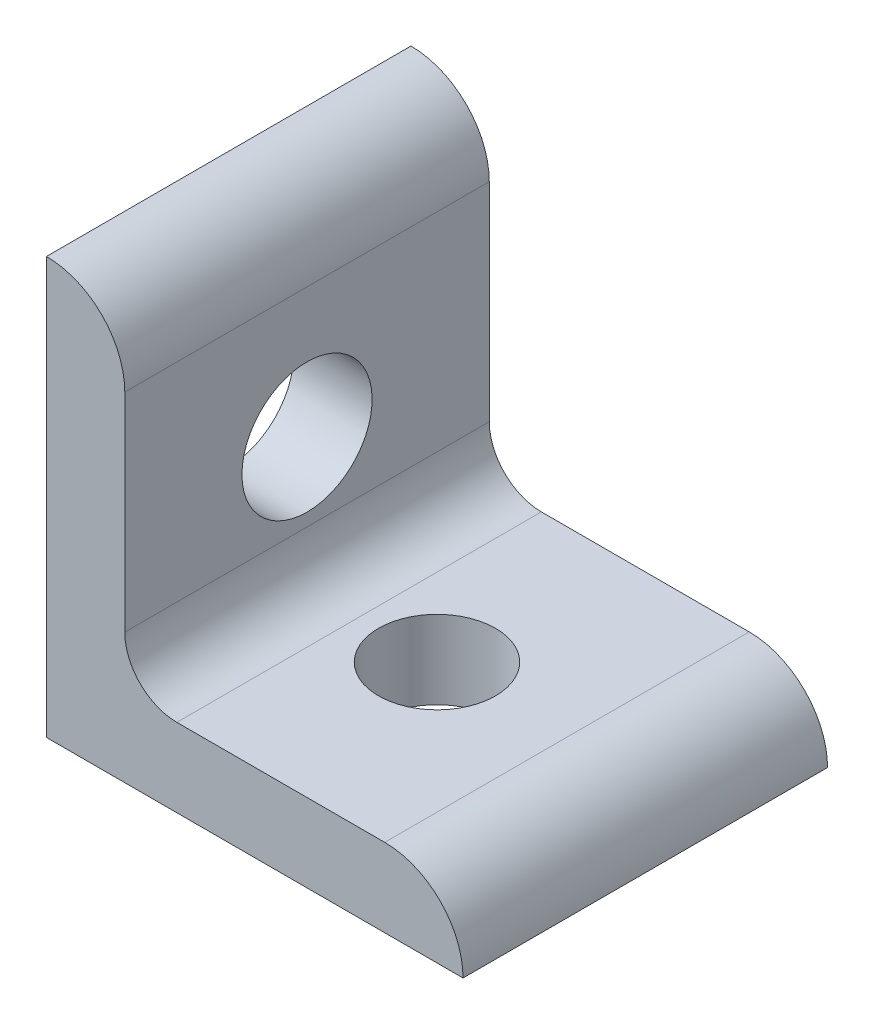
ISO-10303-21;
HEADER;
FILE_DESCRIPTION(('STEP AP214'),'2;1');
FILE_NAME('part.step','',(''),(''),'','','');
FILE_SCHEMA(('AUTOMOTIVE_DESIGN { 1 0 10303 214 1 1 1 1 }'));
ENDSEC;
DATA;
#1=APPLICATION_CONTEXT('core data for automotive mechanical design processes');
#2=APPLICATION_PROTOCOL_DEFINITION('international standard','automotive_design',2000,#1);
#3=PRODUCT_CONTEXT('',#1,'mechanical');
#4=PRODUCT('Part','Part','',(#3));
#5=PRODUCT_RELATED_PRODUCT_CATEGORY('part','',(#4));
#6=PRODUCT_DEFINITION_FORMATION('','',#4);
#7=PRODUCT_DEFINITION_CONTEXT('part definition',#1,'design');
#8=PRODUCT_DEFINITION('design','',#6,#7);
#9=PRODUCT_DEFINITION_SHAPE('','',#8);
#10=(LENGTH_UNIT() NAMED_UNIT(*) SI_UNIT(.MILLI.,.METRE.));
#11=(NAMED_UNIT(*) PLANE_ANGLE_UNIT() SI_UNIT($,.RADIAN.));
#12=(NAMED_UNIT(*) SI_UNIT($,.STERADIAN.) SOLID_ANGLE_UNIT());
#13=UNCERTAINTY_MEASURE_WITH_UNIT(LENGTH_MEASURE(1.E-05),#10,'distance_accuracy_value','');
#14=(GEOMETRIC_REPRESENTATION_CONTEXT(3) GLOBAL_UNCERTAINTY_ASSIGNED_CONTEXT((#13)) GLOBAL_UNIT_ASSIGNED_CONTEXT((#10,
#11,#12)) REPRESENTATION_CONTEXT('',''));
#15=CARTESIAN_POINT('',(0.,0.,0.));
#16=DIRECTION('',(0.,0.,1.));
#17=DIRECTION('',(1.,0.,0.));
#18=AXIS2_PLACEMENT_3D('',#15,#16,#17);
#19=CARTESIAN_POINT('',(4.7752,20.6248,11.1125));
#20=DIRECTION('',(-1.,0.,0.));
#21=DIRECTION('',(0.,-1.,0.));
#22=AXIS2_PLACEMENT_3D('',#19,#20,#21);
#23=PLANE('',#22);
#24=CARTESIAN_POINT('',(4.7752,12.7,0.));
#25=DIRECTION('',(-1.,0.,0.));
#26=DIRECTION('',(0.,-1.,0.));
#27=AXIS2_PLACEMENT_3D('',#24,#25,#26);
#28=CIRCLE('',#27,3.96874999999999);
#29=CARTESIAN_POINT('',(4.7752,8.73125000000001,0.));
#30=VERTEX_POINT('',#29);
#31=EDGE_CURVE('E169',#30,#30,#28,.T.);
#32=ORIENTED_EDGE('',*,*,#31,.T.);
#33=EDGE_LOOP('',(#32));
#34=FACE_BOUND('',#33,.T.);
#35=DIRECTION('',(0.,1.,0.));
#36=VECTOR('',#35,1.);
#37=CARTESIAN_POINT('',(4.7752,20.6248,-11.1125));
#38=LINE('',#37,#36);
#39=CARTESIAN_POINT('',(4.7752,7.9502,-11.1125));
#40=VERTEX_POINT('',#39);
#41=CARTESIAN_POINT('',(4.7752,20.6248,-11.1125));
#42=VERTEX_POINT('',#41);
#43=EDGE_CURVE('E119',#40,#42,#38,.T.);
#44=ORIENTED_EDGE('',*,*,#43,.T.);
#45=DIRECTION('',(0.,0.,-1.));
#46=VECTOR('',#45,1.);
#47=CARTESIAN_POINT('',(4.7752,20.6248,11.1125));
#48=LINE('',#47,#46);
#49=CARTESIAN_POINT('',(4.7752,20.6248,11.1125));
#50=VERTEX_POINT('',#49);
#51=EDGE_CURVE('E117',#50,#42,#48,.T.);
#52=ORIENTED_EDGE('',*,*,#51,.F.);
#53=DIRECTION('',(0.,1.,0.));
#54=VECTOR('',#53,1.);
#55=CARTESIAN_POINT('',(4.7752,20.6248,11.1125));
#56=LINE('',#55,#54);
#57=CARTESIAN_POINT('',(4.7752,7.9502,11.1125));
#58=VERTEX_POINT('',#57);
#59=EDGE_CURVE('E106',#58,#50,#56,.T.);
#60=ORIENTED_EDGE('',*,*,#59,.F.);
#61=DIRECTION('',(0.,0.,-1.));
#62=VECTOR('',#61,1.);
#63=CARTESIAN_POINT('',(4.7752,7.9502,11.1125));
#64=LINE('',#63,#62);
#65=EDGE_CURVE('E120',#58,#40,#64,.T.);
#66=ORIENTED_EDGE('',*,*,#65,.T.);
#67=EDGE_LOOP('',(#44,#52,#60,#66));
#68=FACE_BOUND('',#67,.T.);
#69=ADVANCED_FACE('F38',(#34,#68),#23,.F.);
#70=CARTESIAN_POINT('',(0.,0.,11.1125));
#71=DIRECTION('',(1.,0.,0.));
#72=DIRECTION('',(0.,0.,-1.));
#73=AXIS2_PLACEMENT_3D('',#70,#71,#72);
#74=PLANE('',#73);
#75=CARTESIAN_POINT('',(0.,12.7,0.));
#76=DIRECTION('',(-1.,0.,0.));
#77=DIRECTION('',(0.,0.,1.));
#78=AXIS2_PLACEMENT_3D('',#75,#76,#77);
#79=CIRCLE('',#78,3.96874999999999);
#80=CARTESIAN_POINT('',(0.,12.7,3.96874999999999));
#81=VERTEX_POINT('',#80);
#82=EDGE_CURVE('E172',#81,#81,#79,.T.);
#83=ORIENTED_EDGE('',*,*,#82,.F.);
#84=EDGE_LOOP('',(#83));
#85=FACE_BOUND('',#84,.T.);
#86=DIRECTION('',(0.,-1.,0.));
#87=VECTOR('',#86,1.);
#88=CARTESIAN_POINT('',(0.,0.,-11.1125));
#89=LINE('',#88,#87);
#90=CARTESIAN_POINT('',(0.,25.4,-11.1125));
#91=VERTEX_POINT('',#90);
#92=CARTESIAN_POINT('',(0.,0.,-11.1125));
#93=VERTEX_POINT('',#92);
#94=EDGE_CURVE('E88',#91,#93,#89,.T.);
#95=ORIENTED_EDGE('',*,*,#94,.T.);
#96=DIRECTION('',(0.,0.,-1.));
#97=VECTOR('',#96,1.);
#98=CARTESIAN_POINT('',(0.,0.,11.1125));
#99=LINE('',#98,#97);
#100=CARTESIAN_POINT('',(0.,0.,11.1125));
#101=VERTEX_POINT('',#100);
#102=EDGE_CURVE('E125',#101,#93,#99,.T.);
#103=ORIENTED_EDGE('',*,*,#102,.F.);
#104=DIRECTION('',(0.,-1.,0.));
#105=VECTOR('',#104,1.);
#106=CARTESIAN_POINT('',(0.,0.,11.1125));
#107=LINE('',#106,#105);
#108=CARTESIAN_POINT('',(0.,25.4,11.1125));
#109=VERTEX_POINT('',#108);
#110=EDGE_CURVE('E56',#109,#101,#107,.T.);
#111=ORIENTED_EDGE('',*,*,#110,.F.);
#112=DIRECTION('',(0.,0.,-1.));
#113=VECTOR('',#112,1.);
#114=CARTESIAN_POINT('',(0.,25.4,11.1125));
#115=LINE('',#114,#113);
#116=EDGE_CURVE('E121',#109,#91,#115,.T.);
#117=ORIENTED_EDGE('',*,*,#116,.T.);
#118=EDGE_LOOP('',(#95,#103,#111,#117));
#119=FACE_BOUND('',#118,.T.);
#120=ADVANCED_FACE('F179',(#85,#119),#74,.F.);
#121=CARTESIAN_POINT('',(25.4,0.,11.1125));
#122=DIRECTION('',(0.,1.,0.));
#123=DIRECTION('',(-1.,0.,0.));
#124=AXIS2_PLACEMENT_3D('',#121,#122,#123);
#125=PLANE('',#124);
#126=DIRECTION('',(1.,0.,0.));
#127=VECTOR('',#126,1.);
#128=CARTESIAN_POINT('',(25.4,0.,-11.1125));
#129=LINE('',#128,#127);
#130=CARTESIAN_POINT('',(25.4,0.,-11.1125));
#131=VERTEX_POINT('',#130);
#132=EDGE_CURVE('E129',#93,#131,#129,.T.);
#133=ORIENTED_EDGE('',*,*,#132,.T.);
#134=DIRECTION('',(0.,0.,-1.));
#135=VECTOR('',#134,1.);
#136=CARTESIAN_POINT('',(25.4,0.,11.1125));
#137=LINE('',#136,#135);
#138=CARTESIAN_POINT('',(25.4,0.,11.1125));
#139=VERTEX_POINT('',#138);
#140=EDGE_CURVE('E11',#139,#131,#137,.T.);
#141=ORIENTED_EDGE('',*,*,#140,.F.);
#142=DIRECTION('',(1.,0.,0.));
#143=VECTOR('',#142,1.);
#144=CARTESIAN_POINT('',(25.4,0.,11.1125));
#145=LINE('',#144,#143);
#146=EDGE_CURVE('E141',#101,#139,#145,.T.);
#147=ORIENTED_EDGE('',*,*,#146,.F.);
#148=ORIENTED_EDGE('',*,*,#102,.T.);
#149=EDGE_LOOP('',(#133,#141,#147,#148));
#150=FACE_BOUND('',#149,.T.);
#151=CARTESIAN_POINT('',(12.7,0.,0.));
#152=DIRECTION('',(0.,1.,0.));
#153=DIRECTION('',(0.,0.,1.));
#154=AXIS2_PLACEMENT_3D('',#151,#152,#153);
#155=CIRCLE('',#154,3.5687);
#156=CARTESIAN_POINT('',(12.7,0.,-3.5687));
#157=VERTEX_POINT('',#156);
#158=EDGE_CURVE('E166',#157,#157,#155,.T.);
#159=ORIENTED_EDGE('',*,*,#158,.T.);
#160=EDGE_LOOP('',(#159));
#161=FACE_BOUND('',#160,.T.);
#162=ADVANCED_FACE('F40',(#150,#161),#125,.F.);
#163=CARTESIAN_POINT('',(7.9502,4.7752,11.1125));
#164=DIRECTION('',(0.,-1.,0.));
#165=DIRECTION('',(0.,0.,-1.));
#166=AXIS2_PLACEMENT_3D('',#163,#164,#165);
#167=PLANE('',#166);
#168=DIRECTION('',(-1.,0.,0.));
#169=VECTOR('',#168,1.);
#170=CARTESIAN_POINT('',(7.9502,4.7752,-11.1125));
#171=LINE('',#170,#169);
#172=CARTESIAN_POINT('',(20.6248,4.7752,-11.1125));
#173=VERTEX_POINT('',#172);
#174=CARTESIAN_POINT('',(7.9502,4.7752,-11.1125));
#175=VERTEX_POINT('',#174);
#176=EDGE_CURVE('E134',#173,#175,#171,.T.);
#177=ORIENTED_EDGE('',*,*,#176,.T.);
#178=DIRECTION('',(0.,0.,-1.));
#179=VECTOR('',#178,1.);
#180=CARTESIAN_POINT('',(7.9502,4.7752,11.1125));
#181=LINE('',#180,#179);
#182=CARTESIAN_POINT('',(7.9502,4.7752,11.1125));
#183=VERTEX_POINT('',#182);
#184=EDGE_CURVE('E145',#183,#175,#181,.T.);
#185=ORIENTED_EDGE('',*,*,#184,.F.);
#186=DIRECTION('',(-1.,0.,0.));
#187=VECTOR('',#186,1.);
#188=CARTESIAN_POINT('',(7.9502,4.7752,11.1125));
#189=LINE('',#188,#187);
#190=CARTESIAN_POINT('',(20.6248,4.7752,11.1125));
#191=VERTEX_POINT('',#190);
#192=EDGE_CURVE('E155',#191,#183,#189,.T.);
#193=ORIENTED_EDGE('',*,*,#192,.F.);
#194=DIRECTION('',(0.,0.,-1.));
#195=VECTOR('',#194,1.);
#196=CARTESIAN_POINT('',(20.6248,4.7752,11.1125));
#197=LINE('',#196,#195);
#198=EDGE_CURVE('E48',#191,#173,#197,.T.);
#199=ORIENTED_EDGE('',*,*,#198,.T.);
#200=EDGE_LOOP('',(#177,#185,#193,#199));
#201=FACE_BOUND('',#200,.T.);
#202=CARTESIAN_POINT('',(12.7,4.7752,0.));
#203=DIRECTION('',(0.,-1.,0.));
#204=DIRECTION('',(0.,0.,-1.));
#205=AXIS2_PLACEMENT_3D('',#202,#203,#204);
#206=CIRCLE('',#205,3.5687);
#207=CARTESIAN_POINT('',(12.7,4.7752,-3.5687));
#208=VERTEX_POINT('',#207);
#209=EDGE_CURVE('E42',#208,#208,#206,.F.);
#210=ORIENTED_EDGE('',*,*,#209,.F.);
#211=EDGE_LOOP('',(#210));
#212=FACE_BOUND('',#211,.T.);
#213=ADVANCED_FACE('F152',(#201,#212),#167,.F.);
#214=CARTESIAN_POINT('',(20.6248,0.,11.1125));
#215=DIRECTION('',(0.,0.,-1.));
#216=DIRECTION('',(-1.,0.,0.));
#217=AXIS2_PLACEMENT_3D('',#214,#215,#216);
#218=CYLINDRICAL_SURFACE('',#217,4.7752);
#219=CARTESIAN_POINT('',(20.6248,0.,-11.1125));
#220=DIRECTION('',(0.,0.,1.));
#221=DIRECTION('',(1.,0.,0.));
#222=AXIS2_PLACEMENT_3D('',#219,#220,#221);
#223=CIRCLE('',#222,4.7752);
#224=EDGE_CURVE('E132',#131,#173,#223,.T.);
#225=ORIENTED_EDGE('',*,*,#224,.T.);
#226=ORIENTED_EDGE('',*,*,#198,.F.);
#227=CARTESIAN_POINT('',(20.6248,0.,11.1125));
#228=DIRECTION('',(0.,0.,1.));
#229=DIRECTION('',(1.,0.,0.));
#230=AXIS2_PLACEMENT_3D('',#227,#228,#229);
#231=CIRCLE('',#230,4.7752);
#232=EDGE_CURVE('E96',#139,#191,#231,.T.);
#233=ORIENTED_EDGE('',*,*,#232,.F.);
#234=ORIENTED_EDGE('',*,*,#140,.T.);
#235=EDGE_LOOP('',(#225,#226,#233,#234));
#236=FACE_BOUND('',#235,.T.);
#237=ADVANCED_FACE('F196',(#236),#218,.T.);
#238=CARTESIAN_POINT('',(7.9502,7.9502,11.1125));
#239=DIRECTION('',(0.,0.,-1.));
#240=DIRECTION('',(-1.,0.,0.));
#241=AXIS2_PLACEMENT_3D('',#238,#239,#240);
#242=CYLINDRICAL_SURFACE('',#241,3.175);
#243=CARTESIAN_POINT('',(7.9502,7.9502,-11.1125));
#244=DIRECTION('',(0.,0.,-1.));
#245=DIRECTION('',(1.,0.,0.));
#246=AXIS2_PLACEMENT_3D('',#243,#244,#245);
#247=CIRCLE('',#246,3.175);
#248=EDGE_CURVE('E136',#175,#40,#247,.T.);
#249=ORIENTED_EDGE('',*,*,#248,.T.);
#250=ORIENTED_EDGE('',*,*,#65,.F.);
#251=CARTESIAN_POINT('',(7.9502,7.9502,11.1125));
#252=DIRECTION('',(0.,0.,-1.));
#253=DIRECTION('',(1.,0.,0.));
#254=AXIS2_PLACEMENT_3D('',#251,#252,#253);
#255=CIRCLE('',#254,3.175);
#256=EDGE_CURVE('E112',#183,#58,#255,.T.);
#257=ORIENTED_EDGE('',*,*,#256,.F.);
#258=ORIENTED_EDGE('',*,*,#184,.T.);
#259=EDGE_LOOP('',(#249,#250,#257,#258));
#260=FACE_BOUND('',#259,.T.);
#261=ADVANCED_FACE('F161',(#260),#242,.F.);
#262=CARTESIAN_POINT('',(0.,20.6248,11.1125));
#263=DIRECTION('',(0.,0.,-1.));
#264=DIRECTION('',(-1.,0.,0.));
#265=AXIS2_PLACEMENT_3D('',#262,#263,#264);
#266=CYLINDRICAL_SURFACE('',#265,4.7752);
#267=CARTESIAN_POINT('',(0.,20.6248,-11.1125));
#268=DIRECTION('',(0.,0.,1.));
#269=DIRECTION('',(1.,0.,0.));
#270=AXIS2_PLACEMENT_3D('',#267,#268,#269);
#271=CIRCLE('',#270,4.7752);
#272=EDGE_CURVE('E82',#42,#91,#271,.T.);
#273=ORIENTED_EDGE('',*,*,#272,.T.);
#274=ORIENTED_EDGE('',*,*,#116,.F.);
#275=CARTESIAN_POINT('',(0.,20.6248,11.1125));
#276=DIRECTION('',(0.,0.,1.));
#277=DIRECTION('',(1.,0.,0.));
#278=AXIS2_PLACEMENT_3D('',#275,#276,#277);
#279=CIRCLE('',#278,4.7752);
#280=EDGE_CURVE('E110',#50,#109,#279,.T.);
#281=ORIENTED_EDGE('',*,*,#280,.F.);
#282=ORIENTED_EDGE('',*,*,#51,.T.);
#283=EDGE_LOOP('',(#273,#274,#281,#282));
#284=FACE_BOUND('',#283,.T.);
#285=ADVANCED_FACE('F123',(#284),#266,.T.);
#286=CARTESIAN_POINT('',(0.,20.6248,11.1125));
#287=DIRECTION('',(0.,0.,1.));
#288=DIRECTION('',(1.,0.,0.));
#289=AXIS2_PLACEMENT_3D('',#286,#287,#288);
#290=PLANE('',#289);
#291=ORIENTED_EDGE('',*,*,#146,.T.);
#292=ORIENTED_EDGE('',*,*,#232,.T.);
#293=ORIENTED_EDGE('',*,*,#192,.T.);
#294=ORIENTED_EDGE('',*,*,#256,.T.);
#295=ORIENTED_EDGE('',*,*,#59,.T.);
#296=ORIENTED_EDGE('',*,*,#280,.T.);
#297=ORIENTED_EDGE('',*,*,#110,.T.);
#298=EDGE_LOOP('',(#291,#292,#293,#294,#295,#296,#297));
#299=FACE_BOUND('',#298,.T.);
#300=ADVANCED_FACE('F108',(#299),#290,.T.);
#301=CARTESIAN_POINT('',(0.,20.6248,-11.1125));
#302=DIRECTION('',(0.,0.,1.));
#303=DIRECTION('',(1.,0.,0.));
#304=AXIS2_PLACEMENT_3D('',#301,#302,#303);
#305=PLANE('',#304);
#306=ORIENTED_EDGE('',*,*,#132,.F.);
#307=ORIENTED_EDGE('',*,*,#94,.F.);
#308=ORIENTED_EDGE('',*,*,#272,.F.);
#309=ORIENTED_EDGE('',*,*,#43,.F.);
#310=ORIENTED_EDGE('',*,*,#248,.F.);
#311=ORIENTED_EDGE('',*,*,#176,.F.);
#312=ORIENTED_EDGE('',*,*,#224,.F.);
#313=EDGE_LOOP('',(#306,#307,#308,#309,#310,#311,#312));
#314=FACE_BOUND('',#313,.T.);
#315=ADVANCED_FACE('F159',(#314),#305,.F.);
#316=CARTESIAN_POINT('',(12.7,25.4,0.));
#317=DIRECTION('',(0.,-1.,0.));
#318=DIRECTION('',(0.,0.,-1.));
#319=AXIS2_PLACEMENT_3D('',#316,#317,#318);
#320=CYLINDRICAL_SURFACE('',#319,3.5687);
#321=CARTESIAN_POINT('',(12.7,0.,-3.5687));
#322=CARTESIAN_POINT('',(12.7,0.0497416666666665,-3.5687));
#323=CARTESIAN_POINT('',(12.7,0.0994833333333329,-3.5687));
#324=CARTESIAN_POINT('',(12.7,0.198966666666666,-3.5687));
#325=CARTESIAN_POINT('',(12.7,0.248708333333332,-3.5687));
#326=CARTESIAN_POINT('',(12.7,0.348191666666666,-3.5687));
#327=CARTESIAN_POINT('',(12.7,0.397933333333334,-3.5687));
#328=CARTESIAN_POINT('',(12.7,0.497416666666668,-3.5687));
#329=CARTESIAN_POINT('',(12.7,0.547158333333334,-3.5687));
#330=CARTESIAN_POINT('',(12.7,0.646641666666667,-3.5687));
#331=CARTESIAN_POINT('',(12.7,0.696383333333334,-3.5687));
#332=CARTESIAN_POINT('',(12.7,0.795866666666667,-3.5687));
#333=CARTESIAN_POINT('',(12.7,0.845608333333333,-3.5687));
#334=CARTESIAN_POINT('',(12.7,0.945091666666666,-3.5687));
#335=CARTESIAN_POINT('',(12.7,0.994833333333333,-3.5687));
#336=CARTESIAN_POINT('',(12.7,1.09431666666667,-3.5687));
#337=CARTESIAN_POINT('',(12.7,1.14405833333333,-3.5687));
#338=CARTESIAN_POINT('',(12.7,1.24354166666667,-3.5687));
#339=CARTESIAN_POINT('',(12.7,1.29328333333333,-3.5687));
#340=CARTESIAN_POINT('',(12.7,1.39276666666667,-3.5687));
#341=CARTESIAN_POINT('',(12.7,1.44250833333333,-3.5687));
#342=CARTESIAN_POINT('',(12.7,1.54199166666667,-3.5687));
#343=CARTESIAN_POINT('',(12.7,1.59173333333333,-3.5687));
#344=CARTESIAN_POINT('',(12.7,1.69121666666667,-3.5687));
#345=CARTESIAN_POINT('',(12.7,1.74095833333333,-3.5687));
#346=CARTESIAN_POINT('',(12.7,1.84044166666667,-3.5687));
#347=CARTESIAN_POINT('',(12.7,1.89018333333333,-3.5687));
#348=CARTESIAN_POINT('',(12.7,1.98966666666667,-3.5687));
#349=CARTESIAN_POINT('',(12.7,2.03940833333333,-3.5687));
#350=CARTESIAN_POINT('',(12.7,2.13889166666667,-3.5687));
#351=CARTESIAN_POINT('',(12.7,2.18863333333333,-3.5687));
#352=CARTESIAN_POINT('',(12.7,2.28811666666667,-3.5687));
#353=CARTESIAN_POINT('',(12.7,2.33785833333333,-3.5687));
#354=CARTESIAN_POINT('',(12.7,2.43734166666667,-3.5687));
#355=CARTESIAN_POINT('',(12.7,2.48708333333333,-3.5687));
#356=CARTESIAN_POINT('',(12.7,2.58656666666667,-3.5687));
#357=CARTESIAN_POINT('',(12.7,2.63630833333333,-3.5687));
#358=CARTESIAN_POINT('',(12.7,2.73579166666667,-3.5687));
#359=CARTESIAN_POINT('',(12.7,2.78553333333333,-3.5687));
#360=CARTESIAN_POINT('',(12.7,2.88501666666667,-3.5687));
#361=CARTESIAN_POINT('',(12.7,2.93475833333333,-3.5687));
#362=CARTESIAN_POINT('',(12.7,3.03424166666667,-3.5687));
#363=CARTESIAN_POINT('',(12.7,3.08398333333333,-3.5687));
#364=CARTESIAN_POINT('',(12.7,3.18346666666667,-3.5687));
#365=CARTESIAN_POINT('',(12.7,3.23320833333333,-3.5687));
#366=CARTESIAN_POINT('',(12.7,3.33269166666667,-3.5687));
#367=CARTESIAN_POINT('',(12.7,3.38243333333333,-3.5687));
#368=CARTESIAN_POINT('',(12.7,3.48191666666667,-3.5687));
#369=CARTESIAN_POINT('',(12.7,3.53165833333333,-3.5687));
#370=CARTESIAN_POINT('',(12.7,3.63114166666667,-3.5687));
#371=CARTESIAN_POINT('',(12.7,3.68088333333333,-3.5687));
#372=CARTESIAN_POINT('',(12.7,3.78036666666667,-3.5687));
#373=CARTESIAN_POINT('',(12.7,3.83010833333333,-3.5687));
#374=CARTESIAN_POINT('',(12.7,3.92959166666667,-3.5687));
#375=CARTESIAN_POINT('',(12.7,3.97933333333333,-3.5687));
#376=CARTESIAN_POINT('',(12.7,4.07881666666667,-3.5687));
#377=CARTESIAN_POINT('',(12.7,4.12855833333333,-3.5687));
#378=CARTESIAN_POINT('',(12.7,4.22804166666667,-3.5687));
#379=CARTESIAN_POINT('',(12.7,4.27778333333333,-3.5687));
#380=CARTESIAN_POINT('',(12.7,4.37726666666667,-3.5687));
#381=CARTESIAN_POINT('',(12.7,4.42700833333333,-3.5687));
#382=CARTESIAN_POINT('',(12.7,4.52649166666667,-3.5687));
#383=CARTESIAN_POINT('',(12.7,4.57623333333333,-3.5687));
#384=CARTESIAN_POINT('',(12.7,4.67571666666667,-3.5687));
#385=CARTESIAN_POINT('',(12.7,4.72545833333333,-3.5687));
#386=CARTESIAN_POINT('',(12.7,4.7752,-3.5687));
#387=B_SPLINE_CURVE_WITH_KNOTS('',3,(#321,#322,#323,#324,#325,#326,#327,#328,#329,#330,#331,
#332,#333,#334,#335,#336,#337,#338,#339,#340,#341,#342,#343,#344,#345,#346,#347,#348,#349,#350,
#351,#352,#353,#354,#355,#356,#357,#358,#359,#360,#361,#362,#363,#364,#365,#366,#367,#368,#369,
#370,#371,#372,#373,#374,#375,#376,#377,#378,#379,#380,#381,#382,#383,#384,#385,#386),
.UNSPECIFIED.,.F.,.F.,(4,2,2,2,2,2,2,2,2,2,2,2,2,2,2,2,2,2,2,2,2,2,2,2,2,2,2,2,2,2,2,2,4),(0.,
0.149224999999999,0.298449999999999,0.447675000000002,0.596900000000001,0.746125,0.89535,
1.044575,1.1938,1.343025,1.49225,1.641475,1.7907,1.939925,2.08915,2.238375,2.3876,2.536825,
2.68605,2.835275,2.9845,3.133725,3.28295,3.432175,3.5814,3.730625,3.87985,4.029075,4.1783,
4.327525,4.47675,4.625975,4.7752),.UNSPECIFIED.);
#388=EDGE_CURVE('BSEAM206',#157,#208,#387,.T.);
#389=ORIENTED_EDGE('',*,*,#158,.F.);
#390=ORIENTED_EDGE('',*,*,#209,.T.);
#391=ORIENTED_EDGE('',*,*,#388,.T.);
#392=ORIENTED_EDGE('',*,*,#388,.F.);
#393=EDGE_LOOP('',(#389,#391,#390,#392));
#394=FACE_BOUND('',#393,.T.);
#395=ADVANCED_FACE('F206',(#394),#320,.F.);
#396=CARTESIAN_POINT('',(0.,12.7,0.));
#397=DIRECTION('',(-1.,0.,0.));
#398=DIRECTION('',(0.,0.,1.));
#399=AXIS2_PLACEMENT_3D('',#396,#397,#398);
#400=CYLINDRICAL_SURFACE('',#399,3.96874999999999);
#401=ORIENTED_EDGE('',*,*,#82,.T.);
#402=EDGE_LOOP('',(#401));
#403=FACE_BOUND('',#402,.T.);
#404=ORIENTED_EDGE('',*,*,#31,.F.);
#405=EDGE_LOOP('',(#404));
#406=FACE_BOUND('',#405,.T.);
#407=ADVANCED_FACE('F176',(#403,#406),#400,.F.);
#408=CLOSED_SHELL('',(#69,#120,#162,#213,#237,#261,#285,#300,#315,#395,#407));
#409=MANIFOLD_SOLID_BREP('B2',#408);
#410=ADVANCED_BREP_SHAPE_REPRESENTATION('',(#18,#409),#14);
#411=SHAPE_DEFINITION_REPRESENTATION(#9,#410);
ENDSEC;
END-ISO-10303-21;
